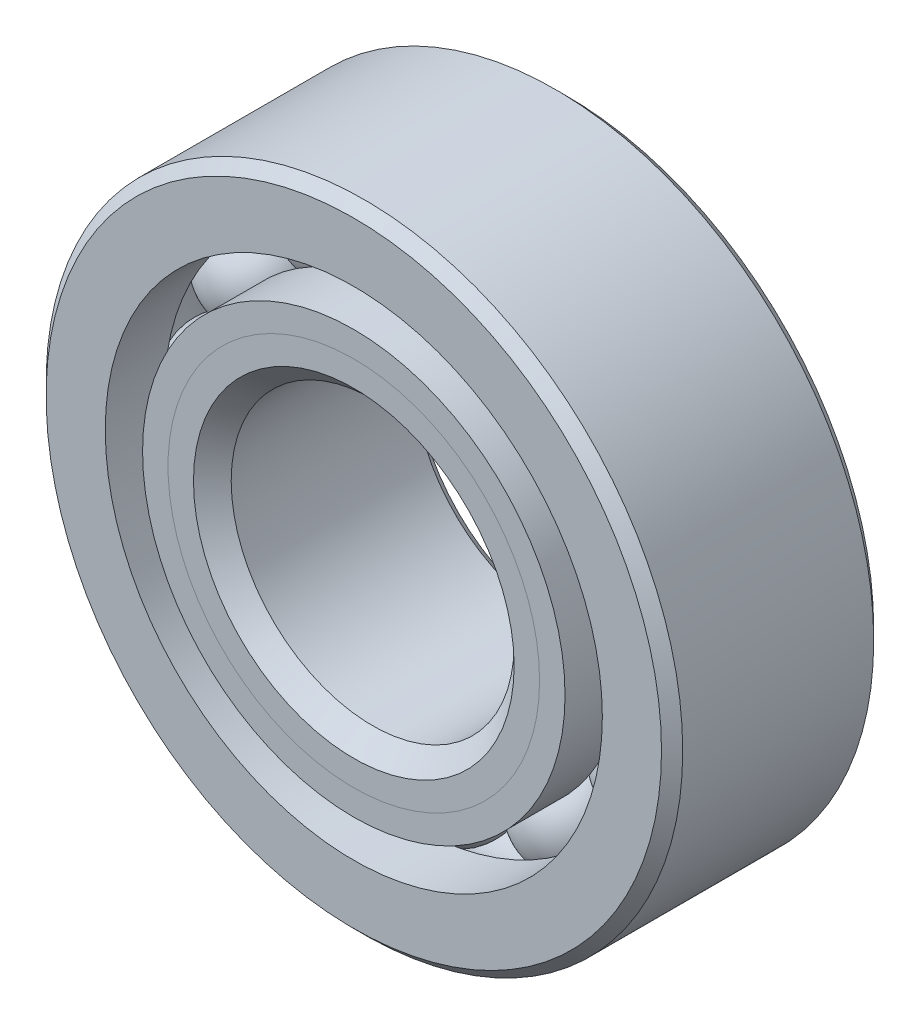
ISO-10303-21;
HEADER;
FILE_DESCRIPTION(('STEP AP214'),'2;1');
FILE_NAME('part.step','',(''),(''),'','','');
FILE_SCHEMA(('AUTOMOTIVE_DESIGN { 1 0 10303 214 1 1 1 1 }'));
ENDSEC;
DATA;
#1=APPLICATION_CONTEXT('core data for automotive mechanical design processes');
#2=APPLICATION_PROTOCOL_DEFINITION('international standard','automotive_design',2000,#1);
#3=PRODUCT_CONTEXT('',#1,'mechanical');
#4=PRODUCT('Part','Part','',(#3));
#5=PRODUCT_RELATED_PRODUCT_CATEGORY('part','',(#4));
#6=PRODUCT_DEFINITION_FORMATION('','',#4);
#7=PRODUCT_DEFINITION_CONTEXT('part definition',#1,'design');
#8=PRODUCT_DEFINITION('design','',#6,#7);
#9=PRODUCT_DEFINITION_SHAPE('','',#8);
#10=(LENGTH_UNIT() NAMED_UNIT(*) SI_UNIT(.MILLI.,.METRE.));
#11=(NAMED_UNIT(*) PLANE_ANGLE_UNIT() SI_UNIT($,.RADIAN.));
#12=(NAMED_UNIT(*) SI_UNIT($,.STERADIAN.) SOLID_ANGLE_UNIT());
#13=UNCERTAINTY_MEASURE_WITH_UNIT(LENGTH_MEASURE(1.E-05),#10,'distance_accuracy_value','');
#14=(GEOMETRIC_REPRESENTATION_CONTEXT(3) GLOBAL_UNCERTAINTY_ASSIGNED_CONTEXT((#13)) GLOBAL_UNIT_ASSIGNED_CONTEXT((#10,
#11,#12)) REPRESENTATION_CONTEXT('',''));
#15=CARTESIAN_POINT('',(0.,0.,0.));
#16=DIRECTION('',(0.,0.,1.));
#17=DIRECTION('',(1.,0.,0.));
#18=AXIS2_PLACEMENT_3D('',#15,#16,#17);
#19=CARTESIAN_POINT('',(-5.15937499999989,8.93629963530074,0.));
#20=DIRECTION('',(0.,0.,1.));
#21=DIRECTION('',(0.499999999999989,-0.866025403784445,0.));
#22=AXIS2_PLACEMENT_3D('',#19,#20,#21);
#23=SPHERICAL_SURFACE('',#22,2.27628073054021);
#24=CARTESIAN_POINT('',(-5.15937499999989,8.93629963530074,2.27628073054021));
#25=VERTEX_POINT('',#24);
#26=VERTEX_LOOP('',#25);
#27=FACE_BOUND('',#26,.T.);
#28=ADVANCED_FACE('F43',(#27),#23,.T.);
#29=CLOSED_SHELL('',(#28));
#30=MANIFOLD_SOLID_BREP('B2',#29);
#31=CARTESIAN_POINT('',(-8.93629963530062,5.1593750000001,0.));
#32=DIRECTION('',(0.,0.,1.));
#33=DIRECTION('',(0.866025403784433,-0.50000000000001,0.));
#34=AXIS2_PLACEMENT_3D('',#31,#32,#33);
#35=SPHERICAL_SURFACE('',#34,2.27628073054021);
#36=CARTESIAN_POINT('',(-8.93629963530062,5.1593750000001,2.27628073054021));
#37=VERTEX_POINT('',#36);
#38=VERTEX_LOOP('',#37);
#39=FACE_BOUND('',#38,.T.);
#40=ADVANCED_FACE('F74',(#39),#35,.T.);
#41=CLOSED_SHELL('',(#40));
#42=MANIFOLD_SOLID_BREP('B6',#41);
#43=CARTESIAN_POINT('',(-10.31875,1.08083231797342E-13,0.));
#44=DIRECTION('',(0.,0.,1.));
#45=DIRECTION('',(1.,0.,0.));
#46=AXIS2_PLACEMENT_3D('',#43,#44,#45);
#47=SPHERICAL_SURFACE('',#46,2.27628073054021);
#48=CARTESIAN_POINT('',(-10.31875,1.08083231797342E-13,2.27628073054021));
#49=VERTEX_POINT('',#48);
#50=VERTEX_LOOP('',#49);
#51=FACE_BOUND('',#50,.T.);
#52=ADVANCED_FACE('F103',(#51),#47,.T.);
#53=CLOSED_SHELL('',(#52));
#54=MANIFOLD_SOLID_BREP('B39',#53);
#55=CARTESIAN_POINT('',(-8.93629963530072,-5.15937499999992,0.));
#56=DIRECTION('',(0.,0.,1.));
#57=DIRECTION('',(0.866025403784443,0.499999999999992,0.));
#58=AXIS2_PLACEMENT_3D('',#55,#56,#57);
#59=SPHERICAL_SURFACE('',#58,2.27628073054021);
#60=CARTESIAN_POINT('',(-8.93629963530072,-5.15937499999992,2.27628073054021));
#61=VERTEX_POINT('',#60);
#62=VERTEX_LOOP('',#61);
#63=FACE_BOUND('',#62,.T.);
#64=ADVANCED_FACE('F132',(#63),#59,.T.);
#65=CLOSED_SHELL('',(#64));
#66=MANIFOLD_SOLID_BREP('B70',#65);
#67=CARTESIAN_POINT('',(-5.15937500000007,-8.93629963530064,0.));
#68=DIRECTION('',(0.,0.,1.));
#69=DIRECTION('',(0.500000000000007,0.866025403784435,0.));
#70=AXIS2_PLACEMENT_3D('',#67,#68,#69);
#71=SPHERICAL_SURFACE('',#70,2.27628073054021);
#72=CARTESIAN_POINT('',(-5.15937500000007,-8.93629963530064,2.27628073054021));
#73=VERTEX_POINT('',#72);
#74=VERTEX_LOOP('',#73);
#75=FACE_BOUND('',#74,.T.);
#76=ADVANCED_FACE('F161',(#75),#71,.T.);
#77=CLOSED_SHELL('',(#76));
#78=MANIFOLD_SOLID_BREP('B99',#77);
#79=CARTESIAN_POINT('',(0.,-10.31875,0.));
#80=DIRECTION('',(0.,0.,1.));
#81=DIRECTION('',(0.,1.,0.));
#82=AXIS2_PLACEMENT_3D('',#79,#80,#81);
#83=SPHERICAL_SURFACE('',#82,2.27628073054021);
#84=CARTESIAN_POINT('',(0.,-10.31875,2.27628073054021));
#85=VERTEX_POINT('',#84);
#86=VERTEX_LOOP('',#85);
#87=FACE_BOUND('',#86,.T.);
#88=ADVANCED_FACE('F190',(#87),#83,.T.);
#89=CLOSED_SHELL('',(#88));
#90=MANIFOLD_SOLID_BREP('B128',#89);
#91=CARTESIAN_POINT('',(5.15937499999995,-8.93629963530071,0.));
#92=DIRECTION('',(0.,0.,1.));
#93=DIRECTION('',(-0.499999999999995,0.866025403784442,0.));
#94=AXIS2_PLACEMENT_3D('',#91,#92,#93);
#95=SPHERICAL_SURFACE('',#94,2.27628073054021);
#96=CARTESIAN_POINT('',(5.15937499999995,-8.93629963530071,2.27628073054021));
#97=VERTEX_POINT('',#96);
#98=VERTEX_LOOP('',#97);
#99=FACE_BOUND('',#98,.T.);
#100=ADVANCED_FACE('F219',(#99),#95,.T.);
#101=CLOSED_SHELL('',(#100));
#102=MANIFOLD_SOLID_BREP('B157',#101);
#103=CARTESIAN_POINT('',(8.93629963530065,-5.15937500000004,0.));
#104=DIRECTION('',(0.,0.,1.));
#105=DIRECTION('',(-0.866025403784436,0.500000000000004,0.));
#106=AXIS2_PLACEMENT_3D('',#103,#104,#105);
#107=SPHERICAL_SURFACE('',#106,2.27628073054021);
#108=CARTESIAN_POINT('',(8.93629963530065,-5.15937500000004,2.27628073054021));
#109=VERTEX_POINT('',#108);
#110=VERTEX_LOOP('',#109);
#111=FACE_BOUND('',#110,.T.);
#112=ADVANCED_FACE('F248',(#111),#107,.T.);
#113=CLOSED_SHELL('',(#112));
#114=MANIFOLD_SOLID_BREP('B186',#113);
#115=CARTESIAN_POINT('',(10.31875,0.,0.));
#116=DIRECTION('',(0.,0.,1.));
#117=DIRECTION('',(-1.,0.,0.));
#118=AXIS2_PLACEMENT_3D('',#115,#116,#117);
#119=SPHERICAL_SURFACE('',#118,2.27628073054021);
#120=CARTESIAN_POINT('',(10.31875,0.,2.27628073054021));
#121=VERTEX_POINT('',#120);
#122=VERTEX_LOOP('',#121);
#123=FACE_BOUND('',#122,.T.);
#124=ADVANCED_FACE('F277',(#123),#119,.T.);
#125=CLOSED_SHELL('',(#124));
#126=MANIFOLD_SOLID_BREP('B215',#125);
#127=CARTESIAN_POINT('',(8.93629963530069,5.15937499999998,0.));
#128=DIRECTION('',(0.,0.,1.));
#129=DIRECTION('',(-0.86602540378444,-0.499999999999998,0.));
#130=AXIS2_PLACEMENT_3D('',#127,#128,#129);
#131=SPHERICAL_SURFACE('',#130,2.27628073054021);
#132=CARTESIAN_POINT('',(8.93629963530069,5.15937499999998,2.27628073054021));
#133=VERTEX_POINT('',#132);
#134=VERTEX_LOOP('',#133);
#135=FACE_BOUND('',#134,.T.);
#136=ADVANCED_FACE('F308',(#135),#131,.T.);
#137=CLOSED_SHELL('',(#136));
#138=MANIFOLD_SOLID_BREP('B244',#137);
#139=CARTESIAN_POINT('',(5.15937500000001,8.93629963530067,0.));
#140=DIRECTION('',(0.,0.,1.));
#141=DIRECTION('',(-0.500000000000001,-0.866025403784438,0.));
#142=AXIS2_PLACEMENT_3D('',#139,#140,#141);
#143=SPHERICAL_SURFACE('',#142,2.27628073054021);
#144=CARTESIAN_POINT('',(5.15937500000001,8.93629963530067,2.27628073054021));
#145=VERTEX_POINT('',#144);
#146=VERTEX_LOOP('',#145);
#147=FACE_BOUND('',#146,.T.);
#148=ADVANCED_FACE('F337',(#147),#143,.T.);
#149=CLOSED_SHELL('',(#148));
#150=MANIFOLD_SOLID_BREP('B273',#149);
#151=CARTESIAN_POINT('',(0.,10.31875,0.));
#152=DIRECTION('',(0.,0.,1.));
#153=DIRECTION('',(0.,-1.,0.));
#154=AXIS2_PLACEMENT_3D('',#151,#152,#153);
#155=SPHERICAL_SURFACE('',#154,2.27628073054021);
#156=CARTESIAN_POINT('',(0.,10.31875,2.27628073054021));
#157=VERTEX_POINT('',#156);
#158=VERTEX_LOOP('',#157);
#159=FACE_BOUND('',#158,.T.);
#160=ADVANCED_FACE('F370',(#159),#155,.T.);
#161=CLOSED_SHELL('',(#160));
#162=MANIFOLD_SOLID_BREP('B304',#161);
#163=CARTESIAN_POINT('',(0.,8.33881099868363,4.7625));
#164=DIRECTION('',(0.,0.,-1.));
#165=DIRECTION('',(-1.,0.,0.));
#166=AXIS2_PLACEMENT_3D('',#163,#164,#165);
#167=PLANE('',#166);
#168=CARTESIAN_POINT('',(0.,0.,4.7625));
#169=DIRECTION('',(0.,0.,1.));
#170=DIRECTION('',(1.,0.,0.));
#171=AXIS2_PLACEMENT_3D('',#168,#169,#170);
#172=CIRCLE('',#171,7.19623463472989);
#173=CARTESIAN_POINT('',(7.19623463472989,0.,4.7625));
#174=VERTEX_POINT('',#173);
#175=EDGE_CURVE('E424',#174,#174,#172,.T.);
#176=ORIENTED_EDGE('',*,*,#175,.F.);
#177=EDGE_LOOP('',(#176));
#178=FACE_BOUND('',#177,.T.);
#179=CARTESIAN_POINT('',(0.,0.,4.7625));
#180=DIRECTION('',(0.,0.,1.));
#181=DIRECTION('',(1.,0.,0.));
#182=AXIS2_PLACEMENT_3D('',#179,#180,#181);
#183=CIRCLE('',#182,8.33881099868363);
#184=CARTESIAN_POINT('',(8.33881099868363,0.,4.7625));
#185=VERTEX_POINT('',#184);
#186=EDGE_CURVE('E369',#185,#185,#183,.T.);
#187=ORIENTED_EDGE('',*,*,#186,.T.);
#188=EDGE_LOOP('',(#187));
#189=FACE_BOUND('',#188,.T.);
#190=ADVANCED_FACE('F390',(#178,#189),#167,.F.);
#191=CARTESIAN_POINT('',(0.,0.,3.61992363604627));
#192=DIRECTION('',(0.,0.,1.));
#193=DIRECTION('',(1.,0.,0.));
#194=AXIS2_PLACEMENT_3D('',#191,#192,#193);
#195=CONICAL_SURFACE('',#194,7.19623463472989,0.78539816339745);
#196=ORIENTED_EDGE('',*,*,#186,.F.);
#197=EDGE_LOOP('',(#196));
#198=FACE_BOUND('',#197,.T.);
#199=CARTESIAN_POINT('',(0.,0.,3.61992363604627));
#200=DIRECTION('',(0.,0.,1.));
#201=DIRECTION('',(1.,0.,0.));
#202=AXIS2_PLACEMENT_3D('',#199,#200,#201);
#203=CIRCLE('',#202,7.19623463472989);
#204=CARTESIAN_POINT('',(7.19623463472989,0.,3.61992363604627));
#205=VERTEX_POINT('',#204);
#206=EDGE_CURVE('E396',#205,#205,#203,.T.);
#207=ORIENTED_EDGE('',*,*,#206,.T.);
#208=EDGE_LOOP('',(#207));
#209=FACE_BOUND('',#208,.T.);
#210=ADVANCED_FACE('F431',(#198,#209),#195,.T.);
#211=CARTESIAN_POINT('',(0.,0.,4.7625));
#212=DIRECTION('',(0.,0.,1.));
#213=DIRECTION('',(1.,0.,0.));
#214=AXIS2_PLACEMENT_3D('',#211,#212,#213);
#215=CYLINDRICAL_SURFACE('',#214,7.19623463472989);
#216=ORIENTED_EDGE('',*,*,#206,.F.);
#217=EDGE_LOOP('',(#216));
#218=FACE_BOUND('',#217,.T.);
#219=CARTESIAN_POINT('',(0.,0.,0.));
#220=DIRECTION('',(0.,0.,1.));
#221=DIRECTION('',(1.,0.,0.));
#222=AXIS2_PLACEMENT_3D('',#219,#220,#221);
#223=CIRCLE('',#222,7.19623463472989);
#224=CARTESIAN_POINT('',(7.19623463472989,0.,0.));
#225=VERTEX_POINT('',#224);
#226=EDGE_CURVE('E400',#225,#225,#223,.T.);
#227=ORIENTED_EDGE('',*,*,#226,.T.);
#228=EDGE_LOOP('',(#227));
#229=FACE_BOUND('',#228,.T.);
#230=ADVANCED_FACE('F435',(#218,#229),#215,.T.);
#231=CARTESIAN_POINT('',(0.,7.19623463472989,0.));
#232=DIRECTION('',(0.,0.,-1.));
#233=DIRECTION('',(-1.,0.,0.));
#234=AXIS2_PLACEMENT_3D('',#231,#232,#233);
#235=PLANE('',#234);
#236=ORIENTED_EDGE('',*,*,#226,.F.);
#237=EDGE_LOOP('',(#236));
#238=FACE_BOUND('',#237,.T.);
#239=CARTESIAN_POINT('',(0.,0.,0.));
#240=DIRECTION('',(0.,0.,1.));
#241=DIRECTION('',(1.,0.,0.));
#242=AXIS2_PLACEMENT_3D('',#239,#240,#241);
#243=CIRCLE('',#242,8.04246926945979);
#244=CARTESIAN_POINT('',(8.04246926945979,0.,0.));
#245=VERTEX_POINT('',#244);
#246=EDGE_CURVE('E404',#245,#245,#243,.T.);
#247=ORIENTED_EDGE('',*,*,#246,.T.);
#248=EDGE_LOOP('',(#247));
#249=FACE_BOUND('',#248,.T.);
#250=ADVANCED_FACE('F440',(#238,#249),#235,.F.);
#251=CARTESIAN_POINT('',(0.,0.,0.));
#252=DIRECTION('',(0.,0.,1.));
#253=DIRECTION('',(1.,0.,0.));
#254=AXIS2_PLACEMENT_3D('',#251,#252,#253);
#255=TOROIDAL_SURFACE('',#254,10.31875,2.27628073054021);
#256=ORIENTED_EDGE('',*,*,#246,.F.);
#257=EDGE_LOOP('',(#256));
#258=FACE_BOUND('',#257,.T.);
#259=CARTESIAN_POINT('',(0.,0.,-2.11666666666667));
#260=DIRECTION('',(0.,0.,1.));
#261=DIRECTION('',(1.,0.,0.));
#262=AXIS2_PLACEMENT_3D('',#259,#260,#261);
#263=CIRCLE('',#262,9.48138736263736);
#264=CARTESIAN_POINT('',(9.48138736263736,0.,-2.11666666666667));
#265=VERTEX_POINT('',#264);
#266=EDGE_CURVE('E409',#265,#265,#263,.T.);
#267=ORIENTED_EDGE('',*,*,#266,.T.);
#268=EDGE_LOOP('',(#267));
#269=FACE_BOUND('',#268,.T.);
#270=ADVANCED_FACE('F446',(#258,#269),#255,.F.);
#271=CARTESIAN_POINT('',(0.,0.,4.7625));
#272=DIRECTION('',(0.,0.,1.));
#273=DIRECTION('',(1.,0.,0.));
#274=AXIS2_PLACEMENT_3D('',#271,#272,#273);
#275=CYLINDRICAL_SURFACE('',#274,9.48138736263736);
#276=ORIENTED_EDGE('',*,*,#266,.F.);
#277=EDGE_LOOP('',(#276));
#278=FACE_BOUND('',#277,.T.);
#279=CARTESIAN_POINT('',(0.,0.,-4.76250000000001));
#280=DIRECTION('',(0.,0.,1.));
#281=DIRECTION('',(1.,0.,0.));
#282=AXIS2_PLACEMENT_3D('',#279,#280,#281);
#283=CIRCLE('',#282,9.48138736263736);
#284=CARTESIAN_POINT('',(9.48138736263736,0.,-4.76250000000001));
#285=VERTEX_POINT('',#284);
#286=EDGE_CURVE('E412',#285,#285,#283,.T.);
#287=ORIENTED_EDGE('',*,*,#286,.T.);
#288=EDGE_LOOP('',(#287));
#289=FACE_BOUND('',#288,.T.);
#290=ADVANCED_FACE('F450',(#278,#289),#275,.T.);
#291=CARTESIAN_POINT('',(0.,6.82625,-4.7625));
#292=DIRECTION('',(0.,0.,1.));
#293=DIRECTION('',(1.,0.,0.));
#294=AXIS2_PLACEMENT_3D('',#291,#292,#293);
#295=PLANE('',#294);
#296=ORIENTED_EDGE('',*,*,#286,.F.);
#297=EDGE_LOOP('',(#296));
#298=FACE_BOUND('',#297,.T.);
#299=CARTESIAN_POINT('',(0.,0.,-4.7625));
#300=DIRECTION('',(0.,0.,1.));
#301=DIRECTION('',(1.,0.,0.));
#302=AXIS2_PLACEMENT_3D('',#299,#300,#301);
#303=CIRCLE('',#302,6.82625);
#304=CARTESIAN_POINT('',(6.82625,0.,-4.7625));
#305=VERTEX_POINT('',#304);
#306=EDGE_CURVE('E415',#305,#305,#303,.T.);
#307=ORIENTED_EDGE('',*,*,#306,.T.);
#308=EDGE_LOOP('',(#307));
#309=FACE_BOUND('',#308,.T.);
#310=ADVANCED_FACE('F454',(#298,#309),#295,.F.);
#311=CARTESIAN_POINT('',(0.,0.,-4.28625));
#312=DIRECTION('',(0.,0.,-1.));
#313=DIRECTION('',(-1.,0.,0.));
#314=AXIS2_PLACEMENT_3D('',#311,#312,#313);
#315=CONICAL_SURFACE('',#314,6.35,0.78539816339745);
#316=ORIENTED_EDGE('',*,*,#306,.F.);
#317=EDGE_LOOP('',(#316));
#318=FACE_BOUND('',#317,.T.);
#319=CARTESIAN_POINT('',(0.,0.,-4.28625));
#320=DIRECTION('',(0.,0.,1.));
#321=DIRECTION('',(1.,0.,0.));
#322=AXIS2_PLACEMENT_3D('',#319,#320,#321);
#323=CIRCLE('',#322,6.35);
#324=CARTESIAN_POINT('',(6.35,0.,-4.28625));
#325=VERTEX_POINT('',#324);
#326=EDGE_CURVE('E418',#325,#325,#323,.T.);
#327=ORIENTED_EDGE('',*,*,#326,.T.);
#328=EDGE_LOOP('',(#327));
#329=FACE_BOUND('',#328,.T.);
#330=ADVANCED_FACE('F458',(#318,#329),#315,.F.);
#331=CARTESIAN_POINT('',(0.,0.,4.7625));
#332=DIRECTION('',(0.,0.,1.));
#333=DIRECTION('',(1.,0.,0.));
#334=AXIS2_PLACEMENT_3D('',#331,#332,#333);
#335=CYLINDRICAL_SURFACE('',#334,6.35);
#336=ORIENTED_EDGE('',*,*,#326,.F.);
#337=EDGE_LOOP('',(#336));
#338=FACE_BOUND('',#337,.T.);
#339=CARTESIAN_POINT('',(0.,0.,3.91626536527011));
#340=DIRECTION('',(0.,0.,1.));
#341=DIRECTION('',(1.,0.,0.));
#342=AXIS2_PLACEMENT_3D('',#339,#340,#341);
#343=CIRCLE('',#342,6.35);
#344=CARTESIAN_POINT('',(6.35,0.,3.91626536527011));
#345=VERTEX_POINT('',#344);
#346=EDGE_CURVE('E421',#345,#345,#343,.T.);
#347=ORIENTED_EDGE('',*,*,#346,.T.);
#348=EDGE_LOOP('',(#347));
#349=FACE_BOUND('',#348,.T.);
#350=ADVANCED_FACE('F462',(#338,#349),#335,.F.);
#351=CARTESIAN_POINT('',(0.,0.,4.7625));
#352=DIRECTION('',(0.,0.,1.));
#353=DIRECTION('',(1.,0.,0.));
#354=AXIS2_PLACEMENT_3D('',#351,#352,#353);
#355=CONICAL_SURFACE('',#354,7.19623463472989,0.78539816339745);
#356=ORIENTED_EDGE('',*,*,#346,.F.);
#357=EDGE_LOOP('',(#356));
#358=FACE_BOUND('',#357,.T.);
#359=ORIENTED_EDGE('',*,*,#175,.T.);
#360=EDGE_LOOP('',(#359));
#361=FACE_BOUND('',#360,.T.);
#362=ADVANCED_FACE('F428',(#358,#361),#355,.F.);
#363=CLOSED_SHELL('',(#190,#210,#230,#250,#270,#290,#310,#330,#350,#362));
#364=MANIFOLD_SOLID_BREP('B333',#363);
#365=CARTESIAN_POINT('',(0.,9.48138736263736,4.7625));
#366=DIRECTION('',(0.,0.,-1.));
#367=DIRECTION('',(-1.,0.,0.));
#368=AXIS2_PLACEMENT_3D('',#365,#366,#367);
#369=PLANE('',#368);
#370=CARTESIAN_POINT('',(0.,0.,4.7625));
#371=DIRECTION('',(0.,0.,1.));
#372=DIRECTION('',(1.,0.,0.));
#373=AXIS2_PLACEMENT_3D('',#370,#371,#372);
#374=CIRCLE('',#373,8.33881099868363);
#375=CARTESIAN_POINT('',(8.33881099868363,0.,4.7625));
#376=VERTEX_POINT('',#375);
#377=EDGE_CURVE('E389',#376,#376,#374,.T.);
#378=ORIENTED_EDGE('',*,*,#377,.F.);
#379=EDGE_LOOP('',(#378));
#380=FACE_BOUND('',#379,.T.);
#381=CARTESIAN_POINT('',(0.,0.,4.7625));
#382=DIRECTION('',(0.,0.,1.));
#383=DIRECTION('',(1.,0.,0.));
#384=AXIS2_PLACEMENT_3D('',#381,#382,#383);
#385=CIRCLE('',#384,9.48138736263736);
#386=CARTESIAN_POINT('',(9.48138736263736,0.,4.7625));
#387=VERTEX_POINT('',#386);
#388=EDGE_CURVE('E570',#387,#387,#385,.T.);
#389=ORIENTED_EDGE('',*,*,#388,.T.);
#390=EDGE_LOOP('',(#389));
#391=FACE_BOUND('',#390,.T.);
#392=ADVANCED_FACE('F548',(#380,#391),#369,.F.);
#393=CARTESIAN_POINT('',(0.,0.,4.7625));
#394=DIRECTION('',(0.,0.,1.));
#395=DIRECTION('',(1.,0.,0.));
#396=AXIS2_PLACEMENT_3D('',#393,#394,#395);
#397=CONICAL_SURFACE('',#396,8.33881099868363,0.78539816339745);
#398=CARTESIAN_POINT('',(0.,0.,3.61992363604627));
#399=DIRECTION('',(0.,0.,1.));
#400=DIRECTION('',(1.,0.,0.));
#401=AXIS2_PLACEMENT_3D('',#398,#399,#400);
#402=CIRCLE('',#401,7.19623463472989);
#403=CARTESIAN_POINT('',(7.19623463472989,0.,3.61992363604627));
#404=VERTEX_POINT('',#403);
#405=EDGE_CURVE('E554',#404,#404,#402,.T.);
#406=ORIENTED_EDGE('',*,*,#405,.F.);
#407=EDGE_LOOP('',(#406));
#408=FACE_BOUND('',#407,.T.);
#409=ORIENTED_EDGE('',*,*,#377,.T.);
#410=EDGE_LOOP('',(#409));
#411=FACE_BOUND('',#410,.T.);
#412=ADVANCED_FACE('F595',(#408,#411),#397,.F.);
#413=CARTESIAN_POINT('',(0.,0.,4.7625));
#414=DIRECTION('',(0.,0.,1.));
#415=DIRECTION('',(1.,0.,0.));
#416=AXIS2_PLACEMENT_3D('',#413,#414,#415);
#417=CYLINDRICAL_SURFACE('',#416,7.19623463472989);
#418=CARTESIAN_POINT('',(0.,0.,0.));
#419=DIRECTION('',(0.,0.,1.));
#420=DIRECTION('',(1.,0.,0.));
#421=AXIS2_PLACEMENT_3D('',#418,#419,#420);
#422=CIRCLE('',#421,7.19623463472989);
#423=CARTESIAN_POINT('',(7.19623463472989,0.,0.));
#424=VERTEX_POINT('',#423);
#425=EDGE_CURVE('E558',#424,#424,#422,.T.);
#426=ORIENTED_EDGE('',*,*,#425,.F.);
#427=EDGE_LOOP('',(#426));
#428=FACE_BOUND('',#427,.T.);
#429=ORIENTED_EDGE('',*,*,#405,.T.);
#430=EDGE_LOOP('',(#429));
#431=FACE_BOUND('',#430,.T.);
#432=ADVANCED_FACE('F590',(#428,#431),#417,.F.);
#433=CARTESIAN_POINT('',(0.,7.19623463472989,0.));
#434=DIRECTION('',(0.,0.,1.));
#435=DIRECTION('',(1.,0.,0.));
#436=AXIS2_PLACEMENT_3D('',#433,#434,#435);
#437=PLANE('',#436);
#438=CARTESIAN_POINT('',(0.,0.,0.));
#439=DIRECTION('',(0.,0.,1.));
#440=DIRECTION('',(1.,0.,0.));
#441=AXIS2_PLACEMENT_3D('',#438,#439,#440);
#442=CIRCLE('',#441,8.04246926945979);
#443=CARTESIAN_POINT('',(8.04246926945979,0.,0.));
#444=VERTEX_POINT('',#443);
#445=EDGE_CURVE('E562',#444,#444,#442,.T.);
#446=ORIENTED_EDGE('',*,*,#445,.F.);
#447=EDGE_LOOP('',(#446));
#448=FACE_BOUND('',#447,.T.);
#449=ORIENTED_EDGE('',*,*,#425,.T.);
#450=EDGE_LOOP('',(#449));
#451=FACE_BOUND('',#450,.T.);
#452=ADVANCED_FACE('F584',(#448,#451),#437,.F.);
#453=CARTESIAN_POINT('',(0.,0.,0.));
#454=DIRECTION('',(0.,0.,1.));
#455=DIRECTION('',(1.,0.,0.));
#456=AXIS2_PLACEMENT_3D('',#453,#454,#455);
#457=TOROIDAL_SURFACE('',#456,10.31875,2.27628073054021);
#458=CARTESIAN_POINT('',(0.,0.,2.11666666666666));
#459=DIRECTION('',(0.,0.,1.));
#460=DIRECTION('',(1.,0.,0.));
#461=AXIS2_PLACEMENT_3D('',#458,#459,#460);
#462=CIRCLE('',#461,9.48138736263736);
#463=CARTESIAN_POINT('',(9.48138736263736,0.,2.11666666666666));
#464=VERTEX_POINT('',#463);
#465=EDGE_CURVE('E567',#464,#464,#462,.T.);
#466=ORIENTED_EDGE('',*,*,#465,.F.);
#467=EDGE_LOOP('',(#466));
#468=FACE_BOUND('',#467,.T.);
#469=ORIENTED_EDGE('',*,*,#445,.T.);
#470=EDGE_LOOP('',(#469));
#471=FACE_BOUND('',#470,.T.);
#472=ADVANCED_FACE('F578',(#468,#471),#457,.F.);
#473=CARTESIAN_POINT('',(0.,0.,4.7625));
#474=DIRECTION('',(0.,0.,1.));
#475=DIRECTION('',(1.,0.,0.));
#476=AXIS2_PLACEMENT_3D('',#473,#474,#475);
#477=CYLINDRICAL_SURFACE('',#476,9.48138736263736);
#478=ORIENTED_EDGE('',*,*,#388,.F.);
#479=EDGE_LOOP('',(#478));
#480=FACE_BOUND('',#479,.T.);
#481=ORIENTED_EDGE('',*,*,#465,.T.);
#482=EDGE_LOOP('',(#481));
#483=FACE_BOUND('',#482,.T.);
#484=ADVANCED_FACE('F575',(#480,#483),#477,.T.);
#485=CLOSED_SHELL('',(#392,#412,#432,#452,#472,#484));
#486=MANIFOLD_SOLID_BREP('B364',#485);
#487=CARTESIAN_POINT('',(0.,0.,4.28625));
#488=DIRECTION('',(0.,0.,-1.));
#489=DIRECTION('',(-1.,0.,0.));
#490=AXIS2_PLACEMENT_3D('',#487,#488,#489);
#491=CONICAL_SURFACE('',#490,14.2875,0.78539816339745);
#492=CARTESIAN_POINT('',(0.,0.,4.7625));
#493=DIRECTION('',(0.,0.,1.));
#494=DIRECTION('',(1.,0.,0.));
#495=AXIS2_PLACEMENT_3D('',#492,#493,#494);
#496=CIRCLE('',#495,13.81125);
#497=CARTESIAN_POINT('',(13.81125,0.,4.7625));
#498=VERTEX_POINT('',#497);
#499=EDGE_CURVE('E667',#498,#498,#496,.T.);
#500=ORIENTED_EDGE('',*,*,#499,.F.);
#501=EDGE_LOOP('',(#500));
#502=FACE_BOUND('',#501,.T.);
#503=CARTESIAN_POINT('',(0.,0.,4.28625));
#504=DIRECTION('',(0.,0.,1.));
#505=DIRECTION('',(1.,0.,0.));
#506=AXIS2_PLACEMENT_3D('',#503,#504,#505);
#507=CIRCLE('',#506,14.2875);
#508=CARTESIAN_POINT('',(14.2875,0.,4.28625));
#509=VERTEX_POINT('',#508);
#510=EDGE_CURVE('E547',#509,#509,#507,.T.);
#511=ORIENTED_EDGE('',*,*,#510,.T.);
#512=EDGE_LOOP('',(#511));
#513=FACE_BOUND('',#512,.T.);
#514=ADVANCED_FACE('F639',(#502,#513),#491,.T.);
#515=CARTESIAN_POINT('',(0.,0.,4.7625));
#516=DIRECTION('',(0.,0.,1.));
#517=DIRECTION('',(1.,0.,0.));
#518=AXIS2_PLACEMENT_3D('',#515,#516,#517);
#519=CYLINDRICAL_SURFACE('',#518,14.2875);
#520=ORIENTED_EDGE('',*,*,#510,.F.);
#521=EDGE_LOOP('',(#520));
#522=FACE_BOUND('',#521,.T.);
#523=CARTESIAN_POINT('',(0.,0.,-4.28625));
#524=DIRECTION('',(0.,0.,1.));
#525=DIRECTION('',(1.,0.,0.));
#526=AXIS2_PLACEMENT_3D('',#523,#524,#525);
#527=CIRCLE('',#526,14.2875);
#528=CARTESIAN_POINT('',(14.2875,0.,-4.28625));
#529=VERTEX_POINT('',#528);
#530=EDGE_CURVE('E645',#529,#529,#527,.T.);
#531=ORIENTED_EDGE('',*,*,#530,.T.);
#532=EDGE_LOOP('',(#531));
#533=FACE_BOUND('',#532,.T.);
#534=ADVANCED_FACE('F674',(#522,#533),#519,.T.);
#535=CARTESIAN_POINT('',(0.,0.,-4.76250000000001));
#536=DIRECTION('',(0.,0.,1.));
#537=DIRECTION('',(1.,0.,0.));
#538=AXIS2_PLACEMENT_3D('',#535,#536,#537);
#539=CONICAL_SURFACE('',#538,13.81125,0.785398163397448);
#540=ORIENTED_EDGE('',*,*,#530,.F.);
#541=EDGE_LOOP('',(#540));
#542=FACE_BOUND('',#541,.T.);
#543=CARTESIAN_POINT('',(0.,0.,-4.76250000000001));
#544=DIRECTION('',(0.,0.,1.));
#545=DIRECTION('',(1.,0.,0.));
#546=AXIS2_PLACEMENT_3D('',#543,#544,#545);
#547=CIRCLE('',#546,13.81125);
#548=CARTESIAN_POINT('',(13.81125,0.,-4.76250000000001));
#549=VERTEX_POINT('',#548);
#550=EDGE_CURVE('E649',#549,#549,#547,.T.);
#551=ORIENTED_EDGE('',*,*,#550,.T.);
#552=EDGE_LOOP('',(#551));
#553=FACE_BOUND('',#552,.T.);
#554=ADVANCED_FACE('F678',(#542,#553),#539,.T.);
#555=CARTESIAN_POINT('',(0.,13.81125,-4.7625));
#556=DIRECTION('',(0.,0.,1.));
#557=DIRECTION('',(1.,0.,0.));
#558=AXIS2_PLACEMENT_3D('',#555,#556,#557);
#559=PLANE('',#558);
#560=ORIENTED_EDGE('',*,*,#550,.F.);
#561=EDGE_LOOP('',(#560));
#562=FACE_BOUND('',#561,.T.);
#563=CARTESIAN_POINT('',(0.,0.,-4.76250000000001));
#564=DIRECTION('',(0.,0.,1.));
#565=DIRECTION('',(1.,0.,0.));
#566=AXIS2_PLACEMENT_3D('',#563,#564,#565);
#567=CIRCLE('',#566,11.1561126373626);
#568=CARTESIAN_POINT('',(11.1561126373626,0.,-4.76250000000001));
#569=VERTEX_POINT('',#568);
#570=EDGE_CURVE('E653',#569,#569,#567,.T.);
#571=ORIENTED_EDGE('',*,*,#570,.T.);
#572=EDGE_LOOP('',(#571));
#573=FACE_BOUND('',#572,.T.);
#574=ADVANCED_FACE('F683',(#562,#573),#559,.F.);
#575=CARTESIAN_POINT('',(0.,0.,4.7625));
#576=DIRECTION('',(0.,0.,1.));
#577=DIRECTION('',(1.,0.,0.));
#578=AXIS2_PLACEMENT_3D('',#575,#576,#577);
#579=CYLINDRICAL_SURFACE('',#578,11.1561126373626);
#580=ORIENTED_EDGE('',*,*,#570,.F.);
#581=EDGE_LOOP('',(#580));
#582=FACE_BOUND('',#581,.T.);
#583=CARTESIAN_POINT('',(0.,0.,-2.11666666666667));
#584=DIRECTION('',(0.,0.,1.));
#585=DIRECTION('',(1.,0.,0.));
#586=AXIS2_PLACEMENT_3D('',#583,#584,#585);
#587=CIRCLE('',#586,11.1561126373626);
#588=CARTESIAN_POINT('',(11.1561126373626,0.,-2.11666666666667));
#589=VERTEX_POINT('',#588);
#590=EDGE_CURVE('E658',#589,#589,#587,.T.);
#591=ORIENTED_EDGE('',*,*,#590,.T.);
#592=EDGE_LOOP('',(#591));
#593=FACE_BOUND('',#592,.T.);
#594=ADVANCED_FACE('F689',(#582,#593),#579,.F.);
#595=CARTESIAN_POINT('',(0.,0.,0.));
#596=DIRECTION('',(0.,0.,1.));
#597=DIRECTION('',(1.,0.,0.));
#598=AXIS2_PLACEMENT_3D('',#595,#596,#597);
#599=TOROIDAL_SURFACE('',#598,10.31875,2.27628073054021);
#600=ORIENTED_EDGE('',*,*,#590,.F.);
#601=EDGE_LOOP('',(#600));
#602=FACE_BOUND('',#601,.T.);
#603=CARTESIAN_POINT('',(0.,0.,2.11666666666667));
#604=DIRECTION('',(0.,0.,1.));
#605=DIRECTION('',(1.,0.,0.));
#606=AXIS2_PLACEMENT_3D('',#603,#604,#605);
#607=CIRCLE('',#606,11.1561126373626);
#608=CARTESIAN_POINT('',(11.1561126373626,0.,2.11666666666667));
#609=VERTEX_POINT('',#608);
#610=EDGE_CURVE('E661',#609,#609,#607,.T.);
#611=ORIENTED_EDGE('',*,*,#610,.T.);
#612=EDGE_LOOP('',(#611));
#613=FACE_BOUND('',#612,.T.);
#614=ADVANCED_FACE('F693',(#602,#613),#599,.F.);
#615=CARTESIAN_POINT('',(0.,0.,4.7625));
#616=DIRECTION('',(0.,0.,1.));
#617=DIRECTION('',(1.,0.,0.));
#618=AXIS2_PLACEMENT_3D('',#615,#616,#617);
#619=CYLINDRICAL_SURFACE('',#618,11.1561126373626);
#620=ORIENTED_EDGE('',*,*,#610,.F.);
#621=EDGE_LOOP('',(#620));
#622=FACE_BOUND('',#621,.T.);
#623=CARTESIAN_POINT('',(0.,0.,4.7625));
#624=DIRECTION('',(0.,0.,1.));
#625=DIRECTION('',(1.,0.,0.));
#626=AXIS2_PLACEMENT_3D('',#623,#624,#625);
#627=CIRCLE('',#626,11.1561126373626);
#628=CARTESIAN_POINT('',(11.1561126373626,0.,4.7625));
#629=VERTEX_POINT('',#628);
#630=EDGE_CURVE('E664',#629,#629,#627,.T.);
#631=ORIENTED_EDGE('',*,*,#630,.T.);
#632=EDGE_LOOP('',(#631));
#633=FACE_BOUND('',#632,.T.);
#634=ADVANCED_FACE('F697',(#622,#633),#619,.F.);
#635=CARTESIAN_POINT('',(0.,13.81125,4.7625));
#636=DIRECTION('',(0.,0.,-1.));
#637=DIRECTION('',(-1.,0.,0.));
#638=AXIS2_PLACEMENT_3D('',#635,#636,#637);
#639=PLANE('',#638);
#640=ORIENTED_EDGE('',*,*,#630,.F.);
#641=EDGE_LOOP('',(#640));
#642=FACE_BOUND('',#641,.T.);
#643=ORIENTED_EDGE('',*,*,#499,.T.);
#644=EDGE_LOOP('',(#643));
#645=FACE_BOUND('',#644,.T.);
#646=ADVANCED_FACE('F671',(#642,#645),#639,.F.);
#647=CLOSED_SHELL('',(#514,#534,#554,#574,#594,#614,#634,#646));
#648=MANIFOLD_SOLID_BREP('B384',#647);
#649=ADVANCED_BREP_SHAPE_REPRESENTATION('',(#18,#30,#42,#54,#66,#78,#90,#102,#114,#126,#138,
#150,#162,#364,#486,#648),#14);
#650=SHAPE_DEFINITION_REPRESENTATION(#9,#649);
ENDSEC;
END-ISO-10303-21;
